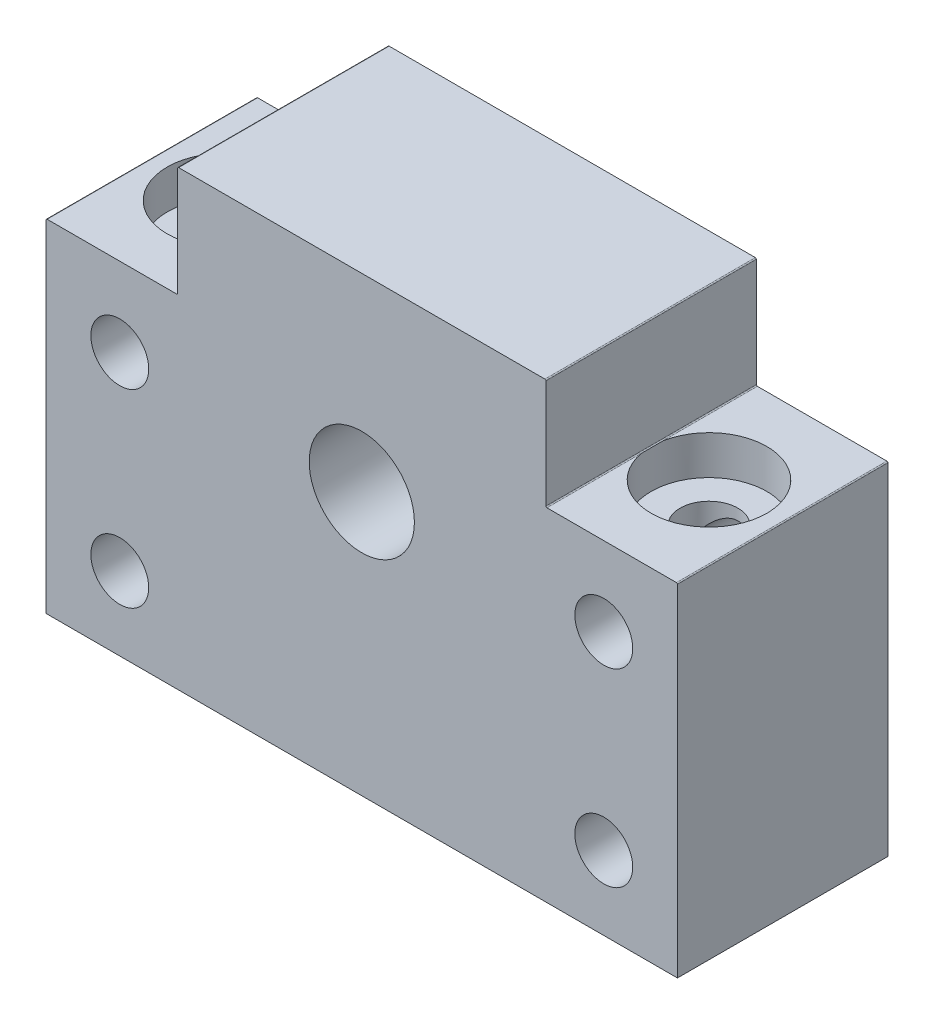
ISO-10303-21;
HEADER;
FILE_DESCRIPTION(('STEP AP214'),'2;1');
FILE_NAME('part.step','',(''),(''),'','','');
FILE_SCHEMA(('AUTOMOTIVE_DESIGN { 1 0 10303 214 1 1 1 1 }'));
ENDSEC;
DATA;
#1=APPLICATION_CONTEXT('core data for automotive mechanical design processes');
#2=APPLICATION_PROTOCOL_DEFINITION('international standard','automotive_design',2000,#1);
#3=PRODUCT_CONTEXT('',#1,'mechanical');
#4=PRODUCT('Part','Part','',(#3));
#5=PRODUCT_RELATED_PRODUCT_CATEGORY('part','',(#4));
#6=PRODUCT_DEFINITION_FORMATION('','',#4);
#7=PRODUCT_DEFINITION_CONTEXT('part definition',#1,'design');
#8=PRODUCT_DEFINITION('design','',#6,#7);
#9=PRODUCT_DEFINITION_SHAPE('','',#8);
#10=(LENGTH_UNIT() NAMED_UNIT(*) SI_UNIT(.MILLI.,.METRE.));
#11=(NAMED_UNIT(*) PLANE_ANGLE_UNIT() SI_UNIT($,.RADIAN.));
#12=(NAMED_UNIT(*) SI_UNIT($,.STERADIAN.) SOLID_ANGLE_UNIT());
#13=UNCERTAINTY_MEASURE_WITH_UNIT(LENGTH_MEASURE(1.E-05),#10,'distance_accuracy_value','');
#14=(GEOMETRIC_REPRESENTATION_CONTEXT(3) GLOBAL_UNCERTAINTY_ASSIGNED_CONTEXT((#13)) GLOBAL_UNIT_ASSIGNED_CONTEXT((#10,
#11,#12)) REPRESENTATION_CONTEXT('',''));
#15=CARTESIAN_POINT('',(0.,0.,0.));
#16=DIRECTION('',(0.,0.,1.));
#17=DIRECTION('',(1.,0.,0.));
#18=AXIS2_PLACEMENT_3D('',#15,#16,#17);
#19=CARTESIAN_POINT('',(23.,-9.24999999999999,0.));
#20=DIRECTION('',(0.,0.,1.));
#21=DIRECTION('',(1.,0.,0.));
#22=AXIS2_PLACEMENT_3D('',#19,#20,#21);
#23=CYLINDRICAL_SURFACE('',#22,2.75);
#24=CARTESIAN_POINT('',(23.,-9.24999999999999,20.));
#25=DIRECTION('',(0.,0.,1.));
#26=DIRECTION('',(1.,0.,0.));
#27=AXIS2_PLACEMENT_3D('',#24,#25,#26);
#28=CIRCLE('',#27,2.75);
#29=CARTESIAN_POINT('',(25.75,-9.24999999999999,20.));
#30=VERTEX_POINT('',#29);
#31=EDGE_CURVE('E318',#30,#30,#28,.T.);
#32=ORIENTED_EDGE('',*,*,#31,.T.);
#33=EDGE_LOOP('',(#32));
#34=FACE_BOUND('',#33,.T.);
#35=CARTESIAN_POINT('',(23.,-9.24999999999999,9.99999999999999));
#36=DIRECTION('',(0.,-0.707106781186547,0.707106781186547));
#37=DIRECTION('',(0.,0.707106781186547,0.707106781186547));
#38=AXIS2_PLACEMENT_3D('',#35,#36,#37);
#39=ELLIPSE('',#38,3.88908729652601,2.75);
#40=CARTESIAN_POINT('',(20.25,-9.24999999999999,9.99999999999999));
#41=VERTEX_POINT('',#40);
#42=CARTESIAN_POINT('',(25.75,-9.24999999999999,9.99999999999999));
#43=VERTEX_POINT('',#42);
#44=EDGE_CURVE('E58',#41,#43,#39,.F.);
#45=ORIENTED_EDGE('',*,*,#44,.T.);
#46=CARTESIAN_POINT('',(23.,-9.24999999999999,9.99999999999999));
#47=DIRECTION('',(0.,0.707106781186547,0.707106781186547));
#48=DIRECTION('',(0.,-0.707106781186547,0.707106781186547));
#49=AXIS2_PLACEMENT_3D('',#46,#47,#48);
#50=ELLIPSE('',#49,3.88908729652601,2.75);
#51=EDGE_CURVE('E381',#43,#41,#50,.F.);
#52=ORIENTED_EDGE('',*,*,#51,.T.);
#53=EDGE_LOOP('',(#45,#52));
#54=FACE_BOUND('',#53,.T.);
#55=ADVANCED_FACE('F43',(#34,#54),#23,.F.);
#56=CARTESIAN_POINT('',(23.,8.75,0.));
#57=DIRECTION('',(0.,0.,1.));
#58=DIRECTION('',(1.,0.,0.));
#59=AXIS2_PLACEMENT_3D('',#56,#57,#58);
#60=CYLINDRICAL_SURFACE('',#59,2.75);
#61=CARTESIAN_POINT('',(23.,8.75,20.));
#62=DIRECTION('',(0.,0.,1.));
#63=DIRECTION('',(1.,0.,0.));
#64=AXIS2_PLACEMENT_3D('',#61,#62,#63);
#65=CIRCLE('',#64,2.75);
#66=CARTESIAN_POINT('',(25.75,8.75,20.));
#67=VERTEX_POINT('',#66);
#68=EDGE_CURVE('E327',#67,#67,#65,.T.);
#69=ORIENTED_EDGE('',*,*,#68,.T.);
#70=EDGE_LOOP('',(#69));
#71=FACE_BOUND('',#70,.T.);
#72=CARTESIAN_POINT('',(23.,8.75,9.99999999999999));
#73=DIRECTION('',(0.,-0.707106781186547,0.707106781186547));
#74=DIRECTION('',(0.,0.707106781186547,0.707106781186547));
#75=AXIS2_PLACEMENT_3D('',#72,#73,#74);
#76=ELLIPSE('',#75,3.88908729652601,2.75);
#77=CARTESIAN_POINT('',(20.25,8.75,9.99999999999999));
#78=VERTEX_POINT('',#77);
#79=CARTESIAN_POINT('',(25.75,8.75,9.99999999999999));
#80=VERTEX_POINT('',#79);
#81=EDGE_CURVE('E64',#78,#80,#76,.F.);
#82=ORIENTED_EDGE('',*,*,#81,.T.);
#83=CARTESIAN_POINT('',(23.,8.75,9.99999999999999));
#84=DIRECTION('',(0.,0.707106781186547,0.707106781186547));
#85=DIRECTION('',(0.,-0.707106781186547,0.707106781186547));
#86=AXIS2_PLACEMENT_3D('',#83,#84,#85);
#87=ELLIPSE('',#86,3.88908729652601,2.75);
#88=EDGE_CURVE('E11',#80,#78,#87,.F.);
#89=ORIENTED_EDGE('',*,*,#88,.T.);
#90=EDGE_LOOP('',(#82,#89));
#91=FACE_BOUND('',#90,.T.);
#92=ADVANCED_FACE('F418',(#71,#91),#60,.F.);
#93=CARTESIAN_POINT('',(-23.,8.75,0.));
#94=DIRECTION('',(0.,0.,1.));
#95=DIRECTION('',(1.,0.,0.));
#96=AXIS2_PLACEMENT_3D('',#93,#94,#95);
#97=CYLINDRICAL_SURFACE('',#96,2.75);
#98=CARTESIAN_POINT('',(-23.,8.75,20.));
#99=DIRECTION('',(0.,0.,1.));
#100=DIRECTION('',(1.,0.,0.));
#101=AXIS2_PLACEMENT_3D('',#98,#99,#100);
#102=CIRCLE('',#101,2.75);
#103=CARTESIAN_POINT('',(-20.25,8.75,20.));
#104=VERTEX_POINT('',#103);
#105=EDGE_CURVE('E310',#104,#104,#102,.T.);
#106=ORIENTED_EDGE('',*,*,#105,.T.);
#107=EDGE_LOOP('',(#106));
#108=FACE_BOUND('',#107,.T.);
#109=CARTESIAN_POINT('',(-23.,8.75,10.));
#110=DIRECTION('',(0.,-0.707106781186547,0.707106781186547));
#111=DIRECTION('',(0.,0.707106781186547,0.707106781186547));
#112=AXIS2_PLACEMENT_3D('',#109,#110,#111);
#113=ELLIPSE('',#112,3.88908729652601,2.75);
#114=CARTESIAN_POINT('',(-25.75,8.75,10.));
#115=VERTEX_POINT('',#114);
#116=CARTESIAN_POINT('',(-20.25,8.75,10.));
#117=VERTEX_POINT('',#116);
#118=EDGE_CURVE('E361',#115,#117,#113,.F.);
#119=ORIENTED_EDGE('',*,*,#118,.T.);
#120=CARTESIAN_POINT('',(-23.,8.75,10.));
#121=DIRECTION('',(0.,0.707106781186547,0.707106781186547));
#122=DIRECTION('',(0.,-0.707106781186547,0.707106781186547));
#123=AXIS2_PLACEMENT_3D('',#120,#121,#122);
#124=ELLIPSE('',#123,3.88908729652601,2.75);
#125=EDGE_CURVE('E349',#117,#115,#124,.F.);
#126=ORIENTED_EDGE('',*,*,#125,.T.);
#127=EDGE_LOOP('',(#119,#126));
#128=FACE_BOUND('',#127,.T.);
#129=ADVANCED_FACE('F425',(#108,#128),#97,.F.);
#130=CARTESIAN_POINT('',(-23.,-9.24999999999999,0.));
#131=DIRECTION('',(0.,0.,1.));
#132=DIRECTION('',(1.,0.,0.));
#133=AXIS2_PLACEMENT_3D('',#130,#131,#132);
#134=CYLINDRICAL_SURFACE('',#133,2.75);
#135=CARTESIAN_POINT('',(-23.,-9.24999999999999,20.));
#136=DIRECTION('',(0.,0.,1.));
#137=DIRECTION('',(1.,0.,0.));
#138=AXIS2_PLACEMENT_3D('',#135,#136,#137);
#139=CIRCLE('',#138,2.75);
#140=CARTESIAN_POINT('',(-20.25,-9.24999999999999,20.));
#141=VERTEX_POINT('',#140);
#142=EDGE_CURVE('E335',#141,#141,#139,.T.);
#143=ORIENTED_EDGE('',*,*,#142,.T.);
#144=EDGE_LOOP('',(#143));
#145=FACE_BOUND('',#144,.T.);
#146=CARTESIAN_POINT('',(-23.,-9.24999999999999,10.));
#147=DIRECTION('',(0.,-0.707106781186547,0.707106781186547));
#148=DIRECTION('',(0.,0.707106781186547,0.707106781186547));
#149=AXIS2_PLACEMENT_3D('',#146,#147,#148);
#150=ELLIPSE('',#149,3.88908729652601,2.75);
#151=CARTESIAN_POINT('',(-25.75,-9.24999999999999,10.));
#152=VERTEX_POINT('',#151);
#153=CARTESIAN_POINT('',(-20.25,-9.24999999999999,10.));
#154=VERTEX_POINT('',#153);
#155=EDGE_CURVE('E468',#152,#154,#150,.F.);
#156=ORIENTED_EDGE('',*,*,#155,.T.);
#157=CARTESIAN_POINT('',(-23.,-9.24999999999999,10.));
#158=DIRECTION('',(0.,0.707106781186547,0.707106781186547));
#159=DIRECTION('',(0.,-0.707106781186547,0.707106781186547));
#160=AXIS2_PLACEMENT_3D('',#157,#158,#159);
#161=ELLIPSE('',#160,3.88908729652601,2.75);
#162=EDGE_CURVE('E484',#154,#152,#161,.F.);
#163=ORIENTED_EDGE('',*,*,#162,.T.);
#164=EDGE_LOOP('',(#156,#163));
#165=FACE_BOUND('',#164,.T.);
#166=ADVANCED_FACE('F632',(#145,#165),#134,.F.);
#167=CARTESIAN_POINT('',(-30.,16.25,20.));
#168=DIRECTION('',(0.,-1.,0.));
#169=DIRECTION('',(0.,0.,-1.));
#170=AXIS2_PLACEMENT_3D('',#167,#168,#169);
#171=PLANE('',#170);
#172=DIRECTION('',(0.,0.,-1.));
#173=VECTOR('',#172,1.);
#174=CARTESIAN_POINT('',(17.6,16.25,20.));
#175=LINE('',#174,#173);
#176=CARTESIAN_POINT('',(17.6,16.25,0.));
#177=VERTEX_POINT('',#176);
#178=CARTESIAN_POINT('',(17.6,16.25,8.95596934910898));
#179=VERTEX_POINT('',#178);
#180=EDGE_CURVE('E201',#177,#179,#175,.F.);
#181=ORIENTED_EDGE('',*,*,#180,.T.);
#182=CARTESIAN_POINT('',(23.,16.25,9.99999999999999));
#183=DIRECTION('',(0.,1.,0.));
#184=DIRECTION('',(0.,0.,1.));
#185=AXIS2_PLACEMENT_3D('',#182,#183,#184);
#186=CIRCLE('',#185,5.5);
#187=CARTESIAN_POINT('',(17.6,16.25,11.044030650891));
#188=VERTEX_POINT('',#187);
#189=EDGE_CURVE('E181',#188,#179,#186,.T.);
#190=ORIENTED_EDGE('',*,*,#189,.F.);
#191=CARTESIAN_POINT('',(17.6,16.25,20.));
#192=VERTEX_POINT('',#191);
#193=EDGE_CURVE('E202',#188,#192,#175,.F.);
#194=ORIENTED_EDGE('',*,*,#193,.T.);
#195=DIRECTION('',(-1.,0.,0.));
#196=VECTOR('',#195,1.);
#197=CARTESIAN_POINT('',(-30.,16.25,20.));
#198=LINE('',#197,#196);
#199=CARTESIAN_POINT('',(29.9,16.25,20.));
#200=VERTEX_POINT('',#199);
#201=EDGE_CURVE('E275',#200,#192,#198,.T.);
#202=ORIENTED_EDGE('',*,*,#201,.F.);
#203=DIRECTION('',(0.,0.,-1.));
#204=VECTOR('',#203,1.);
#205=CARTESIAN_POINT('',(29.9,16.25,20.));
#206=LINE('',#205,#204);
#207=CARTESIAN_POINT('',(29.9,16.25,0.));
#208=VERTEX_POINT('',#207);
#209=EDGE_CURVE('E217',#200,#208,#206,.T.);
#210=ORIENTED_EDGE('',*,*,#209,.T.);
#211=DIRECTION('',(-1.,0.,0.));
#212=VECTOR('',#211,1.);
#213=CARTESIAN_POINT('',(-30.,16.25,0.));
#214=LINE('',#213,#212);
#215=EDGE_CURVE('E209',#208,#177,#214,.T.);
#216=ORIENTED_EDGE('',*,*,#215,.T.);
#217=EDGE_LOOP('',(#181,#190,#194,#202,#210,#216));
#218=FACE_BOUND('',#217,.T.);
#219=ADVANCED_FACE('F206',(#218),#171,.F.);
#220=DIRECTION('',(0.,0.,1.));
#221=VECTOR('',#220,1.);
#222=CARTESIAN_POINT('',(-17.6,16.25,0.));
#223=LINE('',#222,#221);
#224=CARTESIAN_POINT('',(-17.6,16.25,20.));
#225=VERTEX_POINT('',#224);
#226=CARTESIAN_POINT('',(-17.6,16.25,11.0440306508911));
#227=VERTEX_POINT('',#226);
#228=EDGE_CURVE('E230',#225,#227,#223,.F.);
#229=ORIENTED_EDGE('',*,*,#228,.T.);
#230=CARTESIAN_POINT('',(-23.,16.25,10.));
#231=DIRECTION('',(0.,1.,0.));
#232=DIRECTION('',(0.,0.,1.));
#233=AXIS2_PLACEMENT_3D('',#230,#231,#232);
#234=CIRCLE('',#233,5.5);
#235=CARTESIAN_POINT('',(-17.6,16.25,8.95596934910889));
#236=VERTEX_POINT('',#235);
#237=EDGE_CURVE('E376',#236,#227,#234,.T.);
#238=ORIENTED_EDGE('',*,*,#237,.F.);
#239=CARTESIAN_POINT('',(-17.6,16.25,0.));
#240=VERTEX_POINT('',#239);
#241=EDGE_CURVE('E235',#236,#240,#223,.F.);
#242=ORIENTED_EDGE('',*,*,#241,.T.);
#243=CARTESIAN_POINT('',(-29.9,16.25,0.));
#244=VERTEX_POINT('',#243);
#245=EDGE_CURVE('E264',#240,#244,#214,.T.);
#246=ORIENTED_EDGE('',*,*,#245,.T.);
#247=DIRECTION('',(0.,0.,-1.));
#248=VECTOR('',#247,1.);
#249=CARTESIAN_POINT('',(-29.9,16.25,20.));
#250=LINE('',#249,#248);
#251=CARTESIAN_POINT('',(-29.9,16.25,20.));
#252=VERTEX_POINT('',#251);
#253=EDGE_CURVE('E236',#244,#252,#250,.F.);
#254=ORIENTED_EDGE('',*,*,#253,.T.);
#255=EDGE_CURVE('E278',#225,#252,#198,.T.);
#256=ORIENTED_EDGE('',*,*,#255,.F.);
#257=EDGE_LOOP('',(#229,#238,#242,#246,#254,#256));
#258=FACE_BOUND('',#257,.T.);
#259=ADVANCED_FACE('F561',(#258),#171,.F.);
#260=CARTESIAN_POINT('',(30.,16.25,20.));
#261=DIRECTION('',(-1.,0.,0.));
#262=DIRECTION('',(0.,-1.,0.));
#263=AXIS2_PLACEMENT_3D('',#260,#261,#262);
#264=PLANE('',#263);
#265=DIRECTION('',(0.,1.,0.));
#266=VECTOR('',#265,1.);
#267=CARTESIAN_POINT('',(30.,16.25,0.));
#268=LINE('',#267,#266);
#269=CARTESIAN_POINT('',(30.,-16.25,0.));
#270=VERTEX_POINT('',#269);
#271=CARTESIAN_POINT('',(30.,16.15,0.));
#272=VERTEX_POINT('',#271);
#273=EDGE_CURVE('E265',#270,#272,#268,.T.);
#274=ORIENTED_EDGE('',*,*,#273,.T.);
#275=DIRECTION('',(0.,0.,-1.));
#276=VECTOR('',#275,1.);
#277=CARTESIAN_POINT('',(30.,16.15,20.));
#278=LINE('',#277,#276);
#279=CARTESIAN_POINT('',(30.,16.15,20.));
#280=VERTEX_POINT('',#279);
#281=EDGE_CURVE('E527',#272,#280,#278,.F.);
#282=ORIENTED_EDGE('',*,*,#281,.T.);
#283=DIRECTION('',(0.,1.,0.));
#284=VECTOR('',#283,1.);
#285=CARTESIAN_POINT('',(30.,16.25,20.));
#286=LINE('',#285,#284);
#287=CARTESIAN_POINT('',(30.,-16.25,20.));
#288=VERTEX_POINT('',#287);
#289=EDGE_CURVE('E258',#288,#280,#286,.T.);
#290=ORIENTED_EDGE('',*,*,#289,.F.);
#291=DIRECTION('',(0.,0.,-1.));
#292=VECTOR('',#291,1.);
#293=CARTESIAN_POINT('',(30.,-16.25,20.));
#294=LINE('',#293,#292);
#295=EDGE_CURVE('E250',#288,#270,#294,.T.);
#296=ORIENTED_EDGE('',*,*,#295,.T.);
#297=EDGE_LOOP('',(#274,#282,#290,#296));
#298=FACE_BOUND('',#297,.T.);
#299=ADVANCED_FACE('F525',(#298),#264,.F.);
#300=CARTESIAN_POINT('',(-30.,16.25,20.));
#301=DIRECTION('',(1.,0.,0.));
#302=DIRECTION('',(0.,1.,0.));
#303=AXIS2_PLACEMENT_3D('',#300,#301,#302);
#304=PLANE('',#303);
#305=DIRECTION('',(0.,-1.,0.));
#306=VECTOR('',#305,1.);
#307=CARTESIAN_POINT('',(-30.,16.25,20.));
#308=LINE('',#307,#306);
#309=CARTESIAN_POINT('',(-30.,16.15,20.));
#310=VERTEX_POINT('',#309);
#311=CARTESIAN_POINT('',(-30.,-16.25,20.));
#312=VERTEX_POINT('',#311);
#313=EDGE_CURVE('E272',#310,#312,#308,.T.);
#314=ORIENTED_EDGE('',*,*,#313,.F.);
#315=DIRECTION('',(0.,0.,-1.));
#316=VECTOR('',#315,1.);
#317=CARTESIAN_POINT('',(-30.,16.15,20.));
#318=LINE('',#317,#316);
#319=CARTESIAN_POINT('',(-30.,16.15,0.));
#320=VERTEX_POINT('',#319);
#321=EDGE_CURVE('E534',#310,#320,#318,.T.);
#322=ORIENTED_EDGE('',*,*,#321,.T.);
#323=DIRECTION('',(0.,-1.,0.));
#324=VECTOR('',#323,1.);
#325=CARTESIAN_POINT('',(-30.,16.25,0.));
#326=LINE('',#325,#324);
#327=CARTESIAN_POINT('',(-30.,-16.25,0.));
#328=VERTEX_POINT('',#327);
#329=EDGE_CURVE('E259',#320,#328,#326,.T.);
#330=ORIENTED_EDGE('',*,*,#329,.T.);
#331=DIRECTION('',(0.,0.,-1.));
#332=VECTOR('',#331,1.);
#333=CARTESIAN_POINT('',(-30.,-16.25,20.));
#334=LINE('',#333,#332);
#335=EDGE_CURVE('E246',#312,#328,#334,.T.);
#336=ORIENTED_EDGE('',*,*,#335,.F.);
#337=EDGE_LOOP('',(#314,#322,#330,#336));
#338=FACE_BOUND('',#337,.T.);
#339=ADVANCED_FACE('F514',(#338),#304,.F.);
#340=CARTESIAN_POINT('',(-30.,-16.25,20.));
#341=DIRECTION('',(0.,1.,0.));
#342=DIRECTION('',(0.,0.,1.));
#343=AXIS2_PLACEMENT_3D('',#340,#341,#342);
#344=PLANE('',#343);
#345=CARTESIAN_POINT('',(23.,-16.25,9.99999999999999));
#346=DIRECTION('',(0.,1.,0.));
#347=DIRECTION('',(0.,0.,1.));
#348=AXIS2_PLACEMENT_3D('',#345,#346,#347);
#349=CIRCLE('',#348,2.74999999999999);
#350=CARTESIAN_POINT('',(23.,-16.25,12.75));
#351=VERTEX_POINT('',#350);
#352=EDGE_CURVE('E377',#351,#351,#349,.T.);
#353=ORIENTED_EDGE('',*,*,#352,.T.);
#354=EDGE_LOOP('',(#353));
#355=FACE_BOUND('',#354,.T.);
#356=CARTESIAN_POINT('',(-23.,-16.25,10.));
#357=DIRECTION('',(0.,1.,0.));
#358=DIRECTION('',(0.,0.,1.));
#359=AXIS2_PLACEMENT_3D('',#356,#357,#358);
#360=CIRCLE('',#359,2.74999999999999);
#361=CARTESIAN_POINT('',(-23.,-16.25,12.75));
#362=VERTEX_POINT('',#361);
#363=EDGE_CURVE('E319',#362,#362,#360,.T.);
#364=ORIENTED_EDGE('',*,*,#363,.T.);
#365=EDGE_LOOP('',(#364));
#366=FACE_BOUND('',#365,.T.);
#367=DIRECTION('',(1.,0.,0.));
#368=VECTOR('',#367,1.);
#369=CARTESIAN_POINT('',(-30.,-16.25,0.));
#370=LINE('',#369,#368);
#371=EDGE_CURVE('E255',#328,#270,#370,.T.);
#372=ORIENTED_EDGE('',*,*,#371,.T.);
#373=ORIENTED_EDGE('',*,*,#295,.F.);
#374=DIRECTION('',(1.,0.,0.));
#375=VECTOR('',#374,1.);
#376=CARTESIAN_POINT('',(-30.,-16.25,20.));
#377=LINE('',#376,#375);
#378=EDGE_CURVE('E254',#312,#288,#377,.T.);
#379=ORIENTED_EDGE('',*,*,#378,.F.);
#380=ORIENTED_EDGE('',*,*,#335,.T.);
#381=EDGE_LOOP('',(#372,#373,#379,#380));
#382=FACE_BOUND('',#381,.T.);
#383=ADVANCED_FACE('F511',(#355,#366,#382),#344,.F.);
#384=CARTESIAN_POINT('',(0.,0.,20.));
#385=DIRECTION('',(0.,0.,1.));
#386=DIRECTION('',(1.,0.,0.));
#387=AXIS2_PLACEMENT_3D('',#384,#385,#386);
#388=PLANE('',#387);
#389=ORIENTED_EDGE('',*,*,#31,.F.);
#390=EDGE_LOOP('',(#389));
#391=FACE_BOUND('',#390,.T.);
#392=ORIENTED_EDGE('',*,*,#68,.F.);
#393=EDGE_LOOP('',(#392));
#394=FACE_BOUND('',#393,.T.);
#395=ORIENTED_EDGE('',*,*,#142,.F.);
#396=EDGE_LOOP('',(#395));
#397=FACE_BOUND('',#396,.T.);
#398=ORIENTED_EDGE('',*,*,#105,.F.);
#399=EDGE_LOOP('',(#398));
#400=FACE_BOUND('',#399,.T.);
#401=CARTESIAN_POINT('',(0.,8.75,20.));
#402=DIRECTION('',(0.,0.,1.));
#403=DIRECTION('',(1.,0.,0.));
#404=AXIS2_PLACEMENT_3D('',#401,#402,#403);
#405=CIRCLE('',#404,5.);
#406=CARTESIAN_POINT('',(5.,8.75,20.));
#407=VERTEX_POINT('',#406);
#408=EDGE_CURVE('E306',#407,#407,#405,.T.);
#409=ORIENTED_EDGE('',*,*,#408,.F.);
#410=EDGE_LOOP('',(#409));
#411=FACE_BOUND('',#410,.T.);
#412=ORIENTED_EDGE('',*,*,#289,.T.);
#413=CARTESIAN_POINT('',(29.9,16.15,20.));
#414=DIRECTION('',(0.,0.,1.));
#415=DIRECTION('',(1.,0.,0.));
#416=AXIS2_PLACEMENT_3D('',#413,#414,#415);
#417=CIRCLE('',#416,0.1);
#418=EDGE_CURVE('E530',#280,#200,#417,.T.);
#419=ORIENTED_EDGE('',*,*,#418,.T.);
#420=ORIENTED_EDGE('',*,*,#201,.T.);
#421=CARTESIAN_POINT('',(17.6,16.35,20.));
#422=DIRECTION('',(0.,0.,1.));
#423=DIRECTION('',(1.,0.,0.));
#424=AXIS2_PLACEMENT_3D('',#421,#422,#423);
#425=CIRCLE('',#424,0.1);
#426=CARTESIAN_POINT('',(17.5,16.35,20.));
#427=VERTEX_POINT('',#426);
#428=EDGE_CURVE('E463',#192,#427,#425,.F.);
#429=ORIENTED_EDGE('',*,*,#428,.T.);
#430=DIRECTION('',(0.,-1.,0.));
#431=VECTOR('',#430,1.);
#432=CARTESIAN_POINT('',(17.5,26.75,20.));
#433=LINE('',#432,#431);
#434=CARTESIAN_POINT('',(17.5,26.65,20.));
#435=VERTEX_POINT('',#434);
#436=EDGE_CURVE('E293',#435,#427,#433,.T.);
#437=ORIENTED_EDGE('',*,*,#436,.F.);
#438=CARTESIAN_POINT('',(17.4,26.65,20.));
#439=DIRECTION('',(0.,0.,1.));
#440=DIRECTION('',(1.,0.,0.));
#441=AXIS2_PLACEMENT_3D('',#438,#439,#440);
#442=CIRCLE('',#441,0.1);
#443=CARTESIAN_POINT('',(17.4,26.75,20.));
#444=VERTEX_POINT('',#443);
#445=EDGE_CURVE('E595',#435,#444,#442,.T.);
#446=ORIENTED_EDGE('',*,*,#445,.T.);
#447=DIRECTION('',(1.,0.,0.));
#448=VECTOR('',#447,1.);
#449=CARTESIAN_POINT('',(-17.5,26.75,20.));
#450=LINE('',#449,#448);
#451=CARTESIAN_POINT('',(-17.4,26.75,20.));
#452=VERTEX_POINT('',#451);
#453=EDGE_CURVE('E297',#452,#444,#450,.T.);
#454=ORIENTED_EDGE('',*,*,#453,.F.);
#455=CARTESIAN_POINT('',(-17.4,26.65,20.));
#456=DIRECTION('',(0.,0.,1.));
#457=DIRECTION('',(1.,0.,0.));
#458=AXIS2_PLACEMENT_3D('',#455,#456,#457);
#459=CIRCLE('',#458,0.1);
#460=CARTESIAN_POINT('',(-17.5,26.65,20.));
#461=VERTEX_POINT('',#460);
#462=EDGE_CURVE('E542',#452,#461,#459,.T.);
#463=ORIENTED_EDGE('',*,*,#462,.T.);
#464=DIRECTION('',(0.,-1.,0.));
#465=VECTOR('',#464,1.);
#466=CARTESIAN_POINT('',(-17.5,26.75,20.));
#467=LINE('',#466,#465);
#468=CARTESIAN_POINT('',(-17.5,16.35,20.));
#469=VERTEX_POINT('',#468);
#470=EDGE_CURVE('E289',#461,#469,#467,.T.);
#471=ORIENTED_EDGE('',*,*,#470,.T.);
#472=CARTESIAN_POINT('',(-17.6,16.35,20.));
#473=DIRECTION('',(0.,0.,1.));
#474=DIRECTION('',(1.,0.,0.));
#475=AXIS2_PLACEMENT_3D('',#472,#473,#474);
#476=CIRCLE('',#475,0.1);
#477=EDGE_CURVE('E470',#469,#225,#476,.F.);
#478=ORIENTED_EDGE('',*,*,#477,.T.);
#479=ORIENTED_EDGE('',*,*,#255,.T.);
#480=CARTESIAN_POINT('',(-29.9,16.15,20.));
#481=DIRECTION('',(0.,0.,1.));
#482=DIRECTION('',(1.,0.,0.));
#483=AXIS2_PLACEMENT_3D('',#480,#481,#482);
#484=CIRCLE('',#483,0.1);
#485=EDGE_CURVE('E535',#252,#310,#484,.T.);
#486=ORIENTED_EDGE('',*,*,#485,.T.);
#487=ORIENTED_EDGE('',*,*,#313,.T.);
#488=ORIENTED_EDGE('',*,*,#378,.T.);
#489=EDGE_LOOP('',(#412,#419,#420,#429,#437,#446,#454,#463,#471,#478,#479,#486,#487,#488));
#490=FACE_BOUND('',#489,.T.);
#491=ADVANCED_FACE('F447',(#391,#394,#397,#400,#411,#490),#388,.T.);
#492=CARTESIAN_POINT('',(0.,0.,0.));
#493=DIRECTION('',(0.,0.,1.));
#494=DIRECTION('',(1.,0.,0.));
#495=AXIS2_PLACEMENT_3D('',#492,#493,#494);
#496=PLANE('',#495);
#497=CARTESIAN_POINT('',(23.,-9.24999999999999,0.));
#498=DIRECTION('',(0.,0.,1.));
#499=DIRECTION('',(1.,0.,0.));
#500=AXIS2_PLACEMENT_3D('',#497,#498,#499);
#501=CIRCLE('',#500,2.75);
#502=CARTESIAN_POINT('',(25.75,-9.24999999999999,0.));
#503=VERTEX_POINT('',#502);
#504=EDGE_CURVE('E314',#503,#503,#501,.T.);
#505=ORIENTED_EDGE('',*,*,#504,.T.);
#506=EDGE_LOOP('',(#505));
#507=FACE_BOUND('',#506,.T.);
#508=CARTESIAN_POINT('',(23.,8.75,0.));
#509=DIRECTION('',(0.,0.,1.));
#510=DIRECTION('',(1.,0.,0.));
#511=AXIS2_PLACEMENT_3D('',#508,#509,#510);
#512=CIRCLE('',#511,2.75);
#513=CARTESIAN_POINT('',(25.75,8.75,0.));
#514=VERTEX_POINT('',#513);
#515=EDGE_CURVE('E323',#514,#514,#512,.T.);
#516=ORIENTED_EDGE('',*,*,#515,.T.);
#517=EDGE_LOOP('',(#516));
#518=FACE_BOUND('',#517,.T.);
#519=CARTESIAN_POINT('',(-23.,-9.24999999999999,0.));
#520=DIRECTION('',(0.,0.,1.));
#521=DIRECTION('',(1.,0.,0.));
#522=AXIS2_PLACEMENT_3D('',#519,#520,#521);
#523=CIRCLE('',#522,2.75);
#524=CARTESIAN_POINT('',(-20.25,-9.24999999999999,0.));
#525=VERTEX_POINT('',#524);
#526=EDGE_CURVE('E331',#525,#525,#523,.T.);
#527=ORIENTED_EDGE('',*,*,#526,.T.);
#528=EDGE_LOOP('',(#527));
#529=FACE_BOUND('',#528,.T.);
#530=CARTESIAN_POINT('',(-23.,8.75,0.));
#531=DIRECTION('',(0.,0.,1.));
#532=DIRECTION('',(1.,0.,0.));
#533=AXIS2_PLACEMENT_3D('',#530,#531,#532);
#534=CIRCLE('',#533,2.75);
#535=CARTESIAN_POINT('',(-20.25,8.75,0.));
#536=VERTEX_POINT('',#535);
#537=EDGE_CURVE('E339',#536,#536,#534,.T.);
#538=ORIENTED_EDGE('',*,*,#537,.T.);
#539=EDGE_LOOP('',(#538));
#540=FACE_BOUND('',#539,.T.);
#541=CARTESIAN_POINT('',(0.,8.75,0.));
#542=DIRECTION('',(0.,0.,1.));
#543=DIRECTION('',(1.,0.,0.));
#544=AXIS2_PLACEMENT_3D('',#541,#542,#543);
#545=CIRCLE('',#544,5.);
#546=CARTESIAN_POINT('',(5.,8.75,0.));
#547=VERTEX_POINT('',#546);
#548=EDGE_CURVE('E305',#547,#547,#545,.T.);
#549=ORIENTED_EDGE('',*,*,#548,.T.);
#550=EDGE_LOOP('',(#549));
#551=FACE_BOUND('',#550,.T.);
#552=ORIENTED_EDGE('',*,*,#215,.F.);
#553=CARTESIAN_POINT('',(29.9,16.15,0.));
#554=DIRECTION('',(0.,0.,1.));
#555=DIRECTION('',(1.,0.,0.));
#556=AXIS2_PLACEMENT_3D('',#553,#554,#555);
#557=CIRCLE('',#556,0.1);
#558=EDGE_CURVE('E458',#208,#272,#557,.F.);
#559=ORIENTED_EDGE('',*,*,#558,.T.);
#560=ORIENTED_EDGE('',*,*,#273,.F.);
#561=ORIENTED_EDGE('',*,*,#371,.F.);
#562=ORIENTED_EDGE('',*,*,#329,.F.);
#563=CARTESIAN_POINT('',(-29.9,16.15,0.));
#564=DIRECTION('',(0.,0.,1.));
#565=DIRECTION('',(1.,0.,0.));
#566=AXIS2_PLACEMENT_3D('',#563,#564,#565);
#567=CIRCLE('',#566,0.1);
#568=EDGE_CURVE('E576',#320,#244,#567,.F.);
#569=ORIENTED_EDGE('',*,*,#568,.T.);
#570=ORIENTED_EDGE('',*,*,#245,.F.);
#571=CARTESIAN_POINT('',(-17.6,16.35,0.));
#572=DIRECTION('',(0.,0.,1.));
#573=DIRECTION('',(1.,0.,0.));
#574=AXIS2_PLACEMENT_3D('',#571,#572,#573);
#575=CIRCLE('',#574,0.1);
#576=CARTESIAN_POINT('',(-17.5,16.35,0.));
#577=VERTEX_POINT('',#576);
#578=EDGE_CURVE('E464',#240,#577,#575,.T.);
#579=ORIENTED_EDGE('',*,*,#578,.T.);
#580=DIRECTION('',(0.,-1.,0.));
#581=VECTOR('',#580,1.);
#582=CARTESIAN_POINT('',(-17.5,26.75,0.));
#583=LINE('',#582,#581);
#584=CARTESIAN_POINT('',(-17.5,26.65,0.));
#585=VERTEX_POINT('',#584);
#586=EDGE_CURVE('E285',#585,#577,#583,.T.);
#587=ORIENTED_EDGE('',*,*,#586,.F.);
#588=CARTESIAN_POINT('',(-17.4,26.65,0.));
#589=DIRECTION('',(0.,0.,1.));
#590=DIRECTION('',(1.,0.,0.));
#591=AXIS2_PLACEMENT_3D('',#588,#589,#590);
#592=CIRCLE('',#591,0.1);
#593=CARTESIAN_POINT('',(-17.4,26.75,0.));
#594=VERTEX_POINT('',#593);
#595=EDGE_CURVE('E213',#585,#594,#592,.F.);
#596=ORIENTED_EDGE('',*,*,#595,.T.);
#597=DIRECTION('',(-1.,0.,0.));
#598=VECTOR('',#597,1.);
#599=CARTESIAN_POINT('',(-17.5,26.75,0.));
#600=LINE('',#599,#598);
#601=CARTESIAN_POINT('',(17.4,26.75,0.));
#602=VERTEX_POINT('',#601);
#603=EDGE_CURVE('E301',#602,#594,#600,.T.);
#604=ORIENTED_EDGE('',*,*,#603,.F.);
#605=CARTESIAN_POINT('',(17.4,26.65,0.));
#606=DIRECTION('',(0.,0.,1.));
#607=DIRECTION('',(1.,0.,0.));
#608=AXIS2_PLACEMENT_3D('',#605,#606,#607);
#609=CIRCLE('',#608,0.1);
#610=CARTESIAN_POINT('',(17.5,26.65,0.));
#611=VERTEX_POINT('',#610);
#612=EDGE_CURVE('E211',#602,#611,#609,.F.);
#613=ORIENTED_EDGE('',*,*,#612,.T.);
#614=DIRECTION('',(0.,-1.,0.));
#615=VECTOR('',#614,1.);
#616=CARTESIAN_POINT('',(17.5,26.75,0.));
#617=LINE('',#616,#615);
#618=CARTESIAN_POINT('',(17.5,16.35,0.));
#619=VERTEX_POINT('',#618);
#620=EDGE_CURVE('E269',#611,#619,#617,.T.);
#621=ORIENTED_EDGE('',*,*,#620,.T.);
#622=CARTESIAN_POINT('',(17.6,16.35,0.));
#623=DIRECTION('',(0.,0.,1.));
#624=DIRECTION('',(1.,0.,0.));
#625=AXIS2_PLACEMENT_3D('',#622,#623,#624);
#626=CIRCLE('',#625,0.1);
#627=EDGE_CURVE('E459',#619,#177,#626,.T.);
#628=ORIENTED_EDGE('',*,*,#627,.T.);
#629=EDGE_LOOP('',(#552,#559,#560,#561,#562,#569,#570,#579,#587,#596,#604,#613,#621,#628));
#630=FACE_BOUND('',#629,.T.);
#631=ADVANCED_FACE('F443',(#507,#518,#529,#540,#551,#630),#496,.F.);
#632=CARTESIAN_POINT('',(17.5,26.75,0.));
#633=DIRECTION('',(-1.,0.,0.));
#634=DIRECTION('',(0.,0.,1.));
#635=AXIS2_PLACEMENT_3D('',#632,#633,#634);
#636=PLANE('',#635);
#637=ORIENTED_EDGE('',*,*,#436,.T.);
#638=DIRECTION('',(0.,0.,-1.));
#639=VECTOR('',#638,1.);
#640=CARTESIAN_POINT('',(17.5,16.35,0.));
#641=LINE('',#640,#639);
#642=EDGE_CURVE('E221',#427,#619,#641,.T.);
#643=ORIENTED_EDGE('',*,*,#642,.T.);
#644=ORIENTED_EDGE('',*,*,#620,.F.);
#645=DIRECTION('',(0.,0.,-1.));
#646=VECTOR('',#645,1.);
#647=CARTESIAN_POINT('',(17.5,26.65,20.));
#648=LINE('',#647,#646);
#649=EDGE_CURVE('E225',#611,#435,#648,.F.);
#650=ORIENTED_EDGE('',*,*,#649,.T.);
#651=EDGE_LOOP('',(#637,#643,#644,#650));
#652=FACE_BOUND('',#651,.T.);
#653=ADVANCED_FACE('F446',(#652),#636,.F.);
#654=CARTESIAN_POINT('',(-17.5,26.75,0.));
#655=DIRECTION('',(1.,0.,0.));
#656=DIRECTION('',(0.,0.,-1.));
#657=AXIS2_PLACEMENT_3D('',#654,#655,#656);
#658=PLANE('',#657);
#659=ORIENTED_EDGE('',*,*,#586,.T.);
#660=DIRECTION('',(0.,0.,1.));
#661=VECTOR('',#660,1.);
#662=CARTESIAN_POINT('',(-17.5,16.35,20.));
#663=LINE('',#662,#661);
#664=EDGE_CURVE('E239',#577,#469,#663,.T.);
#665=ORIENTED_EDGE('',*,*,#664,.T.);
#666=ORIENTED_EDGE('',*,*,#470,.F.);
#667=DIRECTION('',(0.,0.,1.));
#668=VECTOR('',#667,1.);
#669=CARTESIAN_POINT('',(-17.5,26.65,0.));
#670=LINE('',#669,#668);
#671=EDGE_CURVE('E243',#461,#585,#670,.F.);
#672=ORIENTED_EDGE('',*,*,#671,.T.);
#673=EDGE_LOOP('',(#659,#665,#666,#672));
#674=FACE_BOUND('',#673,.T.);
#675=ADVANCED_FACE('F579',(#674),#658,.F.);
#676=CARTESIAN_POINT('',(0.,26.75,0.));
#677=DIRECTION('',(0.,1.,0.));
#678=DIRECTION('',(0.,0.,1.));
#679=AXIS2_PLACEMENT_3D('',#676,#677,#678);
#680=PLANE('',#679);
#681=ORIENTED_EDGE('',*,*,#603,.T.);
#682=DIRECTION('',(0.,0.,1.));
#683=VECTOR('',#682,1.);
#684=CARTESIAN_POINT('',(-17.4,26.75,20.));
#685=LINE('',#684,#683);
#686=EDGE_CURVE('E549',#594,#452,#685,.T.);
#687=ORIENTED_EDGE('',*,*,#686,.T.);
#688=ORIENTED_EDGE('',*,*,#453,.T.);
#689=DIRECTION('',(0.,0.,-1.));
#690=VECTOR('',#689,1.);
#691=CARTESIAN_POINT('',(17.4,26.75,0.));
#692=LINE('',#691,#690);
#693=EDGE_CURVE('E540',#444,#602,#692,.T.);
#694=ORIENTED_EDGE('',*,*,#693,.T.);
#695=EDGE_LOOP('',(#681,#687,#688,#694));
#696=FACE_BOUND('',#695,.T.);
#697=ADVANCED_FACE('F600',(#696),#680,.T.);
#698=CARTESIAN_POINT('',(-17.6,16.35,0.));
#699=DIRECTION('',(0.,0.,-1.));
#700=DIRECTION('',(-1.,0.,0.));
#701=AXIS2_PLACEMENT_3D('',#698,#699,#700);
#702=CYLINDRICAL_SURFACE('',#701,0.1);
#703=ORIENTED_EDGE('',*,*,#578,.F.);
#704=ORIENTED_EDGE('',*,*,#241,.F.);
#705=EDGE_CURVE('E234',#227,#236,#223,.F.);
#706=ORIENTED_EDGE('',*,*,#705,.F.);
#707=ORIENTED_EDGE('',*,*,#228,.F.);
#708=ORIENTED_EDGE('',*,*,#477,.F.);
#709=ORIENTED_EDGE('',*,*,#664,.F.);
#710=EDGE_LOOP('',(#703,#704,#706,#707,#708,#709));
#711=FACE_BOUND('',#710,.T.);
#712=ADVANCED_FACE('F568',(#711),#702,.F.);
#713=CARTESIAN_POINT('',(17.6,16.35,0.));
#714=DIRECTION('',(0.,0.,1.));
#715=DIRECTION('',(1.,0.,0.));
#716=AXIS2_PLACEMENT_3D('',#713,#714,#715);
#717=CYLINDRICAL_SURFACE('',#716,0.1);
#718=ORIENTED_EDGE('',*,*,#428,.F.);
#719=ORIENTED_EDGE('',*,*,#193,.F.);
#720=EDGE_CURVE('E194',#179,#188,#175,.F.);
#721=ORIENTED_EDGE('',*,*,#720,.F.);
#722=ORIENTED_EDGE('',*,*,#180,.F.);
#723=ORIENTED_EDGE('',*,*,#627,.F.);
#724=ORIENTED_EDGE('',*,*,#642,.F.);
#725=EDGE_LOOP('',(#718,#719,#721,#722,#723,#724));
#726=FACE_BOUND('',#725,.T.);
#727=ADVANCED_FACE('F200',(#726),#717,.F.);
#728=CARTESIAN_POINT('',(29.9,16.15,20.));
#729=DIRECTION('',(0.,0.,-1.));
#730=DIRECTION('',(-1.,0.,0.));
#731=AXIS2_PLACEMENT_3D('',#728,#729,#730);
#732=CYLINDRICAL_SURFACE('',#731,0.1);
#733=ORIENTED_EDGE('',*,*,#418,.F.);
#734=ORIENTED_EDGE('',*,*,#281,.F.);
#735=ORIENTED_EDGE('',*,*,#558,.F.);
#736=ORIENTED_EDGE('',*,*,#209,.F.);
#737=EDGE_LOOP('',(#733,#734,#735,#736));
#738=FACE_BOUND('',#737,.T.);
#739=ADVANCED_FACE('F532',(#738),#732,.T.);
#740=CARTESIAN_POINT('',(-29.9,16.15,20.));
#741=DIRECTION('',(0.,0.,-1.));
#742=DIRECTION('',(-1.,0.,0.));
#743=AXIS2_PLACEMENT_3D('',#740,#741,#742);
#744=CYLINDRICAL_SURFACE('',#743,0.1);
#745=ORIENTED_EDGE('',*,*,#485,.F.);
#746=ORIENTED_EDGE('',*,*,#253,.F.);
#747=ORIENTED_EDGE('',*,*,#568,.F.);
#748=ORIENTED_EDGE('',*,*,#321,.F.);
#749=EDGE_LOOP('',(#745,#746,#747,#748));
#750=FACE_BOUND('',#749,.T.);
#751=ADVANCED_FACE('F615',(#750),#744,.T.);
#752=CARTESIAN_POINT('',(-17.4,26.65,0.));
#753=DIRECTION('',(0.,0.,-1.));
#754=DIRECTION('',(-1.,0.,0.));
#755=AXIS2_PLACEMENT_3D('',#752,#753,#754);
#756=CYLINDRICAL_SURFACE('',#755,0.1);
#757=ORIENTED_EDGE('',*,*,#595,.F.);
#758=ORIENTED_EDGE('',*,*,#671,.F.);
#759=ORIENTED_EDGE('',*,*,#462,.F.);
#760=ORIENTED_EDGE('',*,*,#686,.F.);
#761=EDGE_LOOP('',(#757,#758,#759,#760));
#762=FACE_BOUND('',#761,.T.);
#763=ADVANCED_FACE('F585',(#762),#756,.T.);
#764=CARTESIAN_POINT('',(17.4,26.65,0.));
#765=DIRECTION('',(0.,0.,1.));
#766=DIRECTION('',(1.,0.,0.));
#767=AXIS2_PLACEMENT_3D('',#764,#765,#766);
#768=CYLINDRICAL_SURFACE('',#767,0.1);
#769=ORIENTED_EDGE('',*,*,#445,.F.);
#770=ORIENTED_EDGE('',*,*,#649,.F.);
#771=ORIENTED_EDGE('',*,*,#612,.F.);
#772=ORIENTED_EDGE('',*,*,#693,.F.);
#773=EDGE_LOOP('',(#769,#770,#771,#772));
#774=FACE_BOUND('',#773,.T.);
#775=ADVANCED_FACE('F45',(#774),#768,.T.);
#776=CARTESIAN_POINT('',(0.,8.75,0.));
#777=DIRECTION('',(0.,0.,1.));
#778=DIRECTION('',(1.,0.,0.));
#779=AXIS2_PLACEMENT_3D('',#776,#777,#778);
#780=CYLINDRICAL_SURFACE('',#779,5.);
#781=ORIENTED_EDGE('',*,*,#548,.F.);
#782=EDGE_LOOP('',(#781));
#783=FACE_BOUND('',#782,.T.);
#784=ORIENTED_EDGE('',*,*,#408,.T.);
#785=EDGE_LOOP('',(#784));
#786=FACE_BOUND('',#785,.T.);
#787=ADVANCED_FACE('F608',(#783,#786),#780,.F.);
#788=CARTESIAN_POINT('',(-23.,8.75,10.));
#789=DIRECTION('',(0.,-0.707106781186547,0.707106781186547));
#790=DIRECTION('',(0.,0.707106781186547,0.707106781186547));
#791=AXIS2_PLACEMENT_3D('',#788,#789,#790);
#792=ELLIPSE('',#791,3.88908729652601,2.75);
#793=EDGE_CURVE('E357',#115,#117,#792,.T.);
#794=ORIENTED_EDGE('',*,*,#793,.T.);
#795=CARTESIAN_POINT('',(-23.,8.75,10.));
#796=DIRECTION('',(0.,0.707106781186547,0.707106781186547));
#797=DIRECTION('',(0.,-0.707106781186547,0.707106781186547));
#798=AXIS2_PLACEMENT_3D('',#795,#796,#797);
#799=ELLIPSE('',#798,3.88908729652601,2.75);
#800=EDGE_CURVE('E353',#117,#115,#799,.T.);
#801=ORIENTED_EDGE('',*,*,#800,.T.);
#802=EDGE_LOOP('',(#794,#801));
#803=FACE_BOUND('',#802,.T.);
#804=ORIENTED_EDGE('',*,*,#537,.F.);
#805=EDGE_LOOP('',(#804));
#806=FACE_BOUND('',#805,.T.);
#807=ADVANCED_FACE('F613',(#803,#806),#97,.F.);
#808=CARTESIAN_POINT('',(-23.,-9.24999999999999,10.));
#809=DIRECTION('',(0.,-0.707106781186547,0.707106781186547));
#810=DIRECTION('',(0.,0.707106781186547,0.707106781186547));
#811=AXIS2_PLACEMENT_3D('',#808,#809,#810);
#812=ELLIPSE('',#811,3.88908729652601,2.75);
#813=EDGE_CURVE('E476',#152,#154,#812,.T.);
#814=ORIENTED_EDGE('',*,*,#813,.T.);
#815=CARTESIAN_POINT('',(-23.,-9.24999999999999,10.));
#816=DIRECTION('',(0.,0.707106781186547,0.707106781186547));
#817=DIRECTION('',(0.,-0.707106781186547,0.707106781186547));
#818=AXIS2_PLACEMENT_3D('',#815,#816,#817);
#819=ELLIPSE('',#818,3.88908729652601,2.75);
#820=EDGE_CURVE('E480',#154,#152,#819,.T.);
#821=ORIENTED_EDGE('',*,*,#820,.T.);
#822=EDGE_LOOP('',(#814,#821));
#823=FACE_BOUND('',#822,.T.);
#824=ORIENTED_EDGE('',*,*,#526,.F.);
#825=EDGE_LOOP('',(#824));
#826=FACE_BOUND('',#825,.T.);
#827=ADVANCED_FACE('F438',(#823,#826),#134,.F.);
#828=CARTESIAN_POINT('',(23.,8.75,9.99999999999999));
#829=DIRECTION('',(0.,-0.707106781186547,0.707106781186547));
#830=DIRECTION('',(0.,0.707106781186547,0.707106781186547));
#831=AXIS2_PLACEMENT_3D('',#828,#829,#830);
#832=ELLIPSE('',#831,3.88908729652601,2.75);
#833=EDGE_CURVE('E490',#78,#80,#832,.T.);
#834=ORIENTED_EDGE('',*,*,#833,.T.);
#835=CARTESIAN_POINT('',(23.,8.75,9.99999999999999));
#836=DIRECTION('',(0.,0.707106781186547,0.707106781186547));
#837=DIRECTION('',(0.,-0.707106781186547,0.707106781186547));
#838=AXIS2_PLACEMENT_3D('',#835,#836,#837);
#839=ELLIPSE('',#838,3.88908729652601,2.75);
#840=EDGE_CURVE('E52',#80,#78,#839,.T.);
#841=ORIENTED_EDGE('',*,*,#840,.T.);
#842=EDGE_LOOP('',(#834,#841));
#843=FACE_BOUND('',#842,.T.);
#844=ORIENTED_EDGE('',*,*,#515,.F.);
#845=EDGE_LOOP('',(#844));
#846=FACE_BOUND('',#845,.T.);
#847=ADVANCED_FACE('F428',(#843,#846),#60,.F.);
#848=CARTESIAN_POINT('',(23.,-9.24999999999999,9.99999999999999));
#849=DIRECTION('',(0.,-0.707106781186547,0.707106781186547));
#850=DIRECTION('',(0.,0.707106781186547,0.707106781186547));
#851=AXIS2_PLACEMENT_3D('',#848,#849,#850);
#852=ELLIPSE('',#851,3.88908729652601,2.75);
#853=EDGE_CURVE('E388',#41,#43,#852,.T.);
#854=ORIENTED_EDGE('',*,*,#853,.T.);
#855=CARTESIAN_POINT('',(23.,-9.24999999999999,9.99999999999999));
#856=DIRECTION('',(0.,0.707106781186547,0.707106781186547));
#857=DIRECTION('',(0.,-0.707106781186547,0.707106781186547));
#858=AXIS2_PLACEMENT_3D('',#855,#856,#857);
#859=ELLIPSE('',#858,3.88908729652601,2.75);
#860=EDGE_CURVE('E384',#43,#41,#859,.T.);
#861=ORIENTED_EDGE('',*,*,#860,.T.);
#862=EDGE_LOOP('',(#854,#861));
#863=FACE_BOUND('',#862,.T.);
#864=ORIENTED_EDGE('',*,*,#504,.F.);
#865=EDGE_LOOP('',(#864));
#866=FACE_BOUND('',#865,.T.);
#867=ADVANCED_FACE('F421',(#863,#866),#23,.F.);
#868=CARTESIAN_POINT('',(-23.,16.25,10.));
#869=DIRECTION('',(0.,1.,0.));
#870=DIRECTION('',(0.,0.,1.));
#871=AXIS2_PLACEMENT_3D('',#868,#869,#870);
#872=CYLINDRICAL_SURFACE('',#871,2.74999999999999);
#873=ORIENTED_EDGE('',*,*,#155,.F.);
#874=ORIENTED_EDGE('',*,*,#820,.F.);
#875=EDGE_LOOP('',(#873,#874));
#876=FACE_BOUND('',#875,.T.);
#877=ORIENTED_EDGE('',*,*,#793,.F.);
#878=ORIENTED_EDGE('',*,*,#125,.F.);
#879=EDGE_LOOP('',(#877,#878));
#880=FACE_BOUND('',#879,.T.);
#881=ADVANCED_FACE('F415',(#876,#880),#872,.F.);
#882=CARTESIAN_POINT('',(-17.5,16.25,10.));
#883=DIRECTION('',(0.,1.,0.));
#884=DIRECTION('',(0.,0.,1.));
#885=AXIS2_PLACEMENT_3D('',#882,#883,#884);
#886=PLANE('',#885);
#887=EDGE_CURVE('E372',#227,#236,#234,.T.);
#888=ORIENTED_EDGE('',*,*,#887,.F.);
#889=ORIENTED_EDGE('',*,*,#705,.T.);
#890=EDGE_LOOP('',(#888,#889));
#891=FACE_BOUND('',#890,.T.);
#892=ADVANCED_FACE('F436',(#891),#886,.F.);
#893=CARTESIAN_POINT('',(-23.,16.25,10.));
#894=DIRECTION('',(0.,1.,0.));
#895=DIRECTION('',(0.,0.,1.));
#896=AXIS2_PLACEMENT_3D('',#893,#894,#895);
#897=CYLINDRICAL_SURFACE('',#896,5.5);
#898=CARTESIAN_POINT('',(-23.,12.55,10.));
#899=DIRECTION('',(0.,1.,0.));
#900=DIRECTION('',(0.,0.,1.));
#901=AXIS2_PLACEMENT_3D('',#898,#899,#900);
#902=CIRCLE('',#901,5.5);
#903=CARTESIAN_POINT('',(-23.,12.55,15.5));
#904=VERTEX_POINT('',#903);
#905=EDGE_CURVE('E368',#904,#904,#902,.T.);
#906=ORIENTED_EDGE('',*,*,#905,.F.);
#907=EDGE_LOOP('',(#906));
#908=FACE_BOUND('',#907,.T.);
#909=ORIENTED_EDGE('',*,*,#887,.T.);
#910=ORIENTED_EDGE('',*,*,#237,.T.);
#911=EDGE_LOOP('',(#909,#910));
#912=FACE_BOUND('',#911,.T.);
#913=ADVANCED_FACE('F860',(#908,#912),#897,.F.);
#914=CARTESIAN_POINT('',(-20.25,12.55,10.));
#915=DIRECTION('',(0.,-1.,0.));
#916=DIRECTION('',(0.,0.,-1.));
#917=AXIS2_PLACEMENT_3D('',#914,#915,#916);
#918=PLANE('',#917);
#919=CARTESIAN_POINT('',(-23.,12.55,10.));
#920=DIRECTION('',(0.,1.,0.));
#921=DIRECTION('',(0.,0.,1.));
#922=AXIS2_PLACEMENT_3D('',#919,#920,#921);
#923=CIRCLE('',#922,2.75);
#924=CARTESIAN_POINT('',(-23.,12.55,12.75));
#925=VERTEX_POINT('',#924);
#926=EDGE_CURVE('E364',#925,#925,#923,.T.);
#927=ORIENTED_EDGE('',*,*,#926,.F.);
#928=EDGE_LOOP('',(#927));
#929=FACE_BOUND('',#928,.T.);
#930=ORIENTED_EDGE('',*,*,#905,.T.);
#931=EDGE_LOOP('',(#930));
#932=FACE_BOUND('',#931,.T.);
#933=ADVANCED_FACE('F870',(#929,#932),#918,.F.);
#934=ORIENTED_EDGE('',*,*,#926,.T.);
#935=EDGE_LOOP('',(#934));
#936=FACE_BOUND('',#935,.T.);
#937=ORIENTED_EDGE('',*,*,#118,.F.);
#938=ORIENTED_EDGE('',*,*,#800,.F.);
#939=EDGE_LOOP('',(#937,#938));
#940=FACE_BOUND('',#939,.T.);
#941=ADVANCED_FACE('F412',(#936,#940),#872,.F.);
#942=ORIENTED_EDGE('',*,*,#813,.F.);
#943=ORIENTED_EDGE('',*,*,#162,.F.);
#944=EDGE_LOOP('',(#942,#943));
#945=FACE_BOUND('',#944,.T.);
#946=ORIENTED_EDGE('',*,*,#363,.F.);
#947=EDGE_LOOP('',(#946));
#948=FACE_BOUND('',#947,.T.);
#949=ADVANCED_FACE('F405',(#945,#948),#872,.F.);
#950=CARTESIAN_POINT('',(23.,16.25,9.99999999999999));
#951=DIRECTION('',(0.,1.,0.));
#952=DIRECTION('',(0.,0.,1.));
#953=AXIS2_PLACEMENT_3D('',#950,#951,#952);
#954=CYLINDRICAL_SURFACE('',#953,5.5);
#955=CARTESIAN_POINT('',(23.,12.55,9.99999999999999));
#956=DIRECTION('',(0.,1.,0.));
#957=DIRECTION('',(0.,0.,1.));
#958=AXIS2_PLACEMENT_3D('',#955,#956,#957);
#959=CIRCLE('',#958,5.5);
#960=CARTESIAN_POINT('',(23.,12.55,15.5));
#961=VERTEX_POINT('',#960);
#962=EDGE_CURVE('E196',#961,#961,#959,.T.);
#963=ORIENTED_EDGE('',*,*,#962,.F.);
#964=EDGE_LOOP('',(#963));
#965=FACE_BOUND('',#964,.T.);
#966=EDGE_CURVE('E184',#179,#188,#186,.T.);
#967=ORIENTED_EDGE('',*,*,#966,.T.);
#968=ORIENTED_EDGE('',*,*,#189,.T.);
#969=EDGE_LOOP('',(#967,#968));
#970=FACE_BOUND('',#969,.T.);
#971=ADVANCED_FACE('F183',(#965,#970),#954,.F.);
#972=CARTESIAN_POINT('',(28.5,16.25,9.99999999999999));
#973=DIRECTION('',(0.,1.,0.));
#974=DIRECTION('',(0.,0.,1.));
#975=AXIS2_PLACEMENT_3D('',#972,#973,#974);
#976=PLANE('',#975);
#977=ORIENTED_EDGE('',*,*,#966,.F.);
#978=ORIENTED_EDGE('',*,*,#720,.T.);
#979=EDGE_LOOP('',(#977,#978));
#980=FACE_BOUND('',#979,.T.);
#981=ADVANCED_FACE('F193',(#980),#976,.F.);
#982=CARTESIAN_POINT('',(25.75,12.55,9.99999999999999));
#983=DIRECTION('',(0.,-1.,0.));
#984=DIRECTION('',(0.,0.,-1.));
#985=AXIS2_PLACEMENT_3D('',#982,#983,#984);
#986=PLANE('',#985);
#987=CARTESIAN_POINT('',(23.,12.55,9.99999999999999));
#988=DIRECTION('',(0.,1.,0.));
#989=DIRECTION('',(0.,0.,1.));
#990=AXIS2_PLACEMENT_3D('',#987,#988,#989);
#991=CIRCLE('',#990,2.75);
#992=CARTESIAN_POINT('',(23.,12.55,12.75));
#993=VERTEX_POINT('',#992);
#994=EDGE_CURVE('E394',#993,#993,#991,.T.);
#995=ORIENTED_EDGE('',*,*,#994,.F.);
#996=EDGE_LOOP('',(#995));
#997=FACE_BOUND('',#996,.T.);
#998=ORIENTED_EDGE('',*,*,#962,.T.);
#999=EDGE_LOOP('',(#998));
#1000=FACE_BOUND('',#999,.T.);
#1001=ADVANCED_FACE('F402',(#997,#1000),#986,.F.);
#1002=CARTESIAN_POINT('',(23.,16.25,9.99999999999999));
#1003=DIRECTION('',(0.,1.,0.));
#1004=DIRECTION('',(0.,0.,1.));
#1005=AXIS2_PLACEMENT_3D('',#1002,#1003,#1004);
#1006=CYLINDRICAL_SURFACE('',#1005,2.74999999999999);
#1007=ORIENTED_EDGE('',*,*,#994,.T.);
#1008=EDGE_LOOP('',(#1007));
#1009=FACE_BOUND('',#1008,.T.);
#1010=ORIENTED_EDGE('',*,*,#81,.F.);
#1011=ORIENTED_EDGE('',*,*,#840,.F.);
#1012=EDGE_LOOP('',(#1010,#1011));
#1013=FACE_BOUND('',#1012,.T.);
#1014=ADVANCED_FACE('F498',(#1009,#1013),#1006,.F.);
#1015=ORIENTED_EDGE('',*,*,#833,.F.);
#1016=ORIENTED_EDGE('',*,*,#88,.F.);
#1017=EDGE_LOOP('',(#1015,#1016));
#1018=FACE_BOUND('',#1017,.T.);
#1019=ORIENTED_EDGE('',*,*,#44,.F.);
#1020=ORIENTED_EDGE('',*,*,#860,.F.);
#1021=EDGE_LOOP('',(#1019,#1020));
#1022=FACE_BOUND('',#1021,.T.);
#1023=ADVANCED_FACE('F500',(#1018,#1022),#1006,.F.);
#1024=ORIENTED_EDGE('',*,*,#853,.F.);
#1025=ORIENTED_EDGE('',*,*,#51,.F.);
#1026=EDGE_LOOP('',(#1024,#1025));
#1027=FACE_BOUND('',#1026,.T.);
#1028=ORIENTED_EDGE('',*,*,#352,.F.);
#1029=EDGE_LOOP('',(#1028));
#1030=FACE_BOUND('',#1029,.T.);
#1031=ADVANCED_FACE('F503',(#1027,#1030),#1006,.F.);
#1032=CLOSED_SHELL('',(#55,#92,#129,#166,#219,#259,#299,#339,#383,#491,#631,#653,#675,#697,#712,
#727,#739,#751,#763,#775,#787,#807,#827,#847,#867,#881,#892,#913,#933,#941,#949,#971,#981,#1001,
#1014,#1023,#1031));
#1033=MANIFOLD_SOLID_BREP('B2',#1032);
#1034=ADVANCED_BREP_SHAPE_REPRESENTATION('',(#18,#1033),#14);
#1035=SHAPE_DEFINITION_REPRESENTATION(#9,#1034);
ENDSEC;
END-ISO-10303-21;
